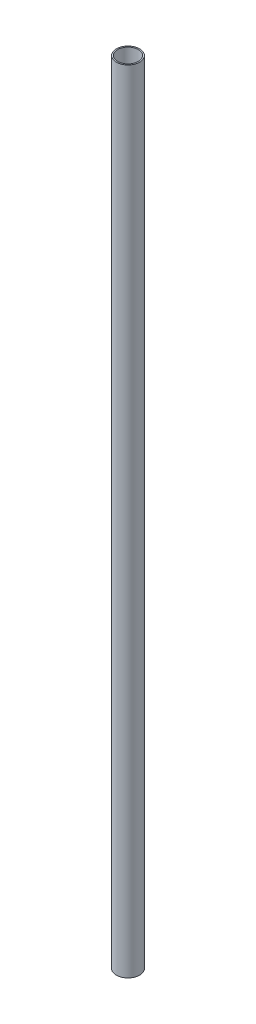
ISO-10303-21;
HEADER;
FILE_DESCRIPTION(('STEP AP214'),'2;1');
FILE_NAME('part.step','',(''),(''),'','','');
FILE_SCHEMA(('AUTOMOTIVE_DESIGN { 1 0 10303 214 1 1 1 1 }'));
ENDSEC;
DATA;
#1=APPLICATION_CONTEXT('core data for automotive mechanical design processes');
#2=APPLICATION_PROTOCOL_DEFINITION('international standard','automotive_design',2000,#1);
#3=PRODUCT_CONTEXT('',#1,'mechanical');
#4=PRODUCT('Part','Part','',(#3));
#5=PRODUCT_RELATED_PRODUCT_CATEGORY('part','',(#4));
#6=PRODUCT_DEFINITION_FORMATION('','',#4);
#7=PRODUCT_DEFINITION_CONTEXT('part definition',#1,'design');
#8=PRODUCT_DEFINITION('design','',#6,#7);
#9=PRODUCT_DEFINITION_SHAPE('','',#8);
#10=(LENGTH_UNIT() NAMED_UNIT(*) SI_UNIT(.MILLI.,.METRE.));
#11=(NAMED_UNIT(*) PLANE_ANGLE_UNIT() SI_UNIT($,.RADIAN.));
#12=(NAMED_UNIT(*) SI_UNIT($,.STERADIAN.) SOLID_ANGLE_UNIT());
#13=UNCERTAINTY_MEASURE_WITH_UNIT(LENGTH_MEASURE(1.E-05),#10,'distance_accuracy_value','');
#14=(GEOMETRIC_REPRESENTATION_CONTEXT(3) GLOBAL_UNCERTAINTY_ASSIGNED_CONTEXT((#13)) GLOBAL_UNIT_ASSIGNED_CONTEXT((#10,
#11,#12)) REPRESENTATION_CONTEXT('',''));
#15=CARTESIAN_POINT('',(0.,0.,0.));
#16=DIRECTION('',(0.,0.,1.));
#17=DIRECTION('',(1.,0.,0.));
#18=AXIS2_PLACEMENT_3D('',#15,#16,#17);
#19=CARTESIAN_POINT('',(0.,539.75,0.));
#20=DIRECTION('',(0.,1.,0.));
#21=DIRECTION('',(0.,0.,1.));
#22=AXIS2_PLACEMENT_3D('',#19,#20,#21);
#23=PLANE('',#22);
#24=CARTESIAN_POINT('',(0.,539.75,0.));
#25=DIRECTION('',(0.,1.,0.));
#26=DIRECTION('',(0.,0.,1.));
#27=AXIS2_PLACEMENT_3D('',#24,#25,#26);
#28=CIRCLE('',#27,7.9375);
#29=CARTESIAN_POINT('',(0.,539.75,7.9375));
#30=VERTEX_POINT('',#29);
#31=EDGE_CURVE('E10',#30,#30,#28,.T.);
#32=ORIENTED_EDGE('',*,*,#31,.T.);
#33=EDGE_LOOP('',(#32));
#34=FACE_BOUND('',#33,.T.);
#35=CARTESIAN_POINT('',(0.,539.75,0.));
#36=DIRECTION('',(0.,1.,0.));
#37=DIRECTION('',(0.,0.,1.));
#38=AXIS2_PLACEMENT_3D('',#35,#36,#37);
#39=CIRCLE('',#38,7.0485);
#40=CARTESIAN_POINT('',(0.,539.75,7.0485));
#41=VERTEX_POINT('',#40);
#42=EDGE_CURVE('E48',#41,#41,#39,.T.);
#43=ORIENTED_EDGE('',*,*,#42,.F.);
#44=EDGE_LOOP('',(#43));
#45=FACE_BOUND('',#44,.T.);
#46=ADVANCED_FACE('F37',(#34,#45),#23,.T.);
#47=CARTESIAN_POINT('',(0.,0.,0.));
#48=DIRECTION('',(0.,1.,0.));
#49=DIRECTION('',(0.,0.,1.));
#50=AXIS2_PLACEMENT_3D('',#47,#48,#49);
#51=PLANE('',#50);
#52=CARTESIAN_POINT('',(0.,0.,0.));
#53=DIRECTION('',(0.,1.,0.));
#54=DIRECTION('',(0.,0.,1.));
#55=AXIS2_PLACEMENT_3D('',#52,#53,#54);
#56=CIRCLE('',#55,7.9375);
#57=CARTESIAN_POINT('',(0.,0.,7.9375));
#58=VERTEX_POINT('',#57);
#59=EDGE_CURVE('E41',#58,#58,#56,.T.);
#60=ORIENTED_EDGE('',*,*,#59,.F.);
#61=EDGE_LOOP('',(#60));
#62=FACE_BOUND('',#61,.T.);
#63=CARTESIAN_POINT('',(0.,0.,0.));
#64=DIRECTION('',(0.,1.,0.));
#65=DIRECTION('',(0.,0.,1.));
#66=AXIS2_PLACEMENT_3D('',#63,#64,#65);
#67=CIRCLE('',#66,7.0485);
#68=CARTESIAN_POINT('',(0.,0.,7.0485));
#69=VERTEX_POINT('',#68);
#70=EDGE_CURVE('E50',#69,#69,#67,.T.);
#71=ORIENTED_EDGE('',*,*,#70,.T.);
#72=EDGE_LOOP('',(#71));
#73=FACE_BOUND('',#72,.T.);
#74=ADVANCED_FACE('F60',(#62,#73),#51,.F.);
#75=CARTESIAN_POINT('',(0.,539.75,0.));
#76=DIRECTION('',(0.,-1.,0.));
#77=DIRECTION('',(0.,0.,-1.));
#78=AXIS2_PLACEMENT_3D('',#75,#76,#77);
#79=CYLINDRICAL_SURFACE('',#78,7.9375);
#80=ORIENTED_EDGE('',*,*,#31,.F.);
#81=EDGE_LOOP('',(#80));
#82=FACE_BOUND('',#81,.T.);
#83=ORIENTED_EDGE('',*,*,#59,.T.);
#84=EDGE_LOOP('',(#83));
#85=FACE_BOUND('',#84,.T.);
#86=ADVANCED_FACE('F39',(#82,#85),#79,.T.);
#87=CARTESIAN_POINT('',(0.,539.75,0.));
#88=DIRECTION('',(0.,-1.,0.));
#89=DIRECTION('',(0.,0.,-1.));
#90=AXIS2_PLACEMENT_3D('',#87,#88,#89);
#91=CYLINDRICAL_SURFACE('',#90,7.0485);
#92=ORIENTED_EDGE('',*,*,#42,.T.);
#93=EDGE_LOOP('',(#92));
#94=FACE_BOUND('',#93,.T.);
#95=ORIENTED_EDGE('',*,*,#70,.F.);
#96=EDGE_LOOP('',(#95));
#97=FACE_BOUND('',#96,.T.);
#98=ADVANCED_FACE('F56',(#94,#97),#91,.F.);
#99=CLOSED_SHELL('',(#46,#74,#86,#98));
#100=MANIFOLD_SOLID_BREP('B2',#99);
#101=ADVANCED_BREP_SHAPE_REPRESENTATION('',(#18,#100),#14);
#102=SHAPE_DEFINITION_REPRESENTATION(#9,#101);
ENDSEC;
END-ISO-10303-21;
